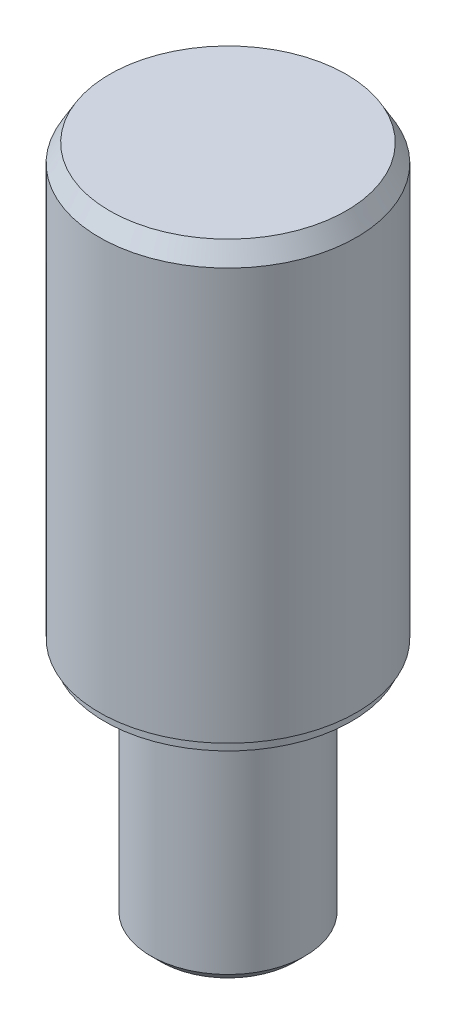
ISO-10303-21;
HEADER;
FILE_DESCRIPTION(('STEP AP214'),'2;1');
FILE_NAME('part.step','',(''),(''),'','','');
FILE_SCHEMA(('AUTOMOTIVE_DESIGN { 1 0 10303 214 1 1 1 1 }'));
ENDSEC;
DATA;
#1=APPLICATION_CONTEXT('core data for automotive mechanical design processes');
#2=APPLICATION_PROTOCOL_DEFINITION('international standard','automotive_design',2000,#1);
#3=PRODUCT_CONTEXT('',#1,'mechanical');
#4=PRODUCT('Part','Part','',(#3));
#5=PRODUCT_RELATED_PRODUCT_CATEGORY('part','',(#4));
#6=PRODUCT_DEFINITION_FORMATION('','',#4);
#7=PRODUCT_DEFINITION_CONTEXT('part definition',#1,'design');
#8=PRODUCT_DEFINITION('design','',#6,#7);
#9=PRODUCT_DEFINITION_SHAPE('','',#8);
#10=(LENGTH_UNIT() NAMED_UNIT(*) SI_UNIT(.MILLI.,.METRE.));
#11=(NAMED_UNIT(*) PLANE_ANGLE_UNIT() SI_UNIT($,.RADIAN.));
#12=(NAMED_UNIT(*) SI_UNIT($,.STERADIAN.) SOLID_ANGLE_UNIT());
#13=UNCERTAINTY_MEASURE_WITH_UNIT(LENGTH_MEASURE(1.E-05),#10,'distance_accuracy_value','');
#14=(GEOMETRIC_REPRESENTATION_CONTEXT(3) GLOBAL_UNCERTAINTY_ASSIGNED_CONTEXT((#13)) GLOBAL_UNIT_ASSIGNED_CONTEXT((#10,
#11,#12)) REPRESENTATION_CONTEXT('',''));
#15=CARTESIAN_POINT('',(0.,0.,0.));
#16=DIRECTION('',(0.,0.,1.));
#17=DIRECTION('',(1.,0.,0.));
#18=AXIS2_PLACEMENT_3D('',#15,#16,#17);
#19=CARTESIAN_POINT('',(6.5,-23.7320508075689,0.));
#20=DIRECTION('',(0.,-1.,0.));
#21=DIRECTION('',(0.,0.,-1.));
#22=AXIS2_PLACEMENT_3D('',#19,#20,#21);
#23=PLANE('',#22);
#24=CARTESIAN_POINT('',(0.,-23.7320508075689,0.));
#25=DIRECTION('',(0.,-1.,0.));
#26=DIRECTION('',(0.,0.,-1.));
#27=AXIS2_PLACEMENT_3D('',#24,#25,#26);
#28=CIRCLE('',#27,6.5);
#29=CARTESIAN_POINT('',(0.,-23.7320508075689,-6.5));
#30=VERTEX_POINT('',#29);
#31=EDGE_CURVE('E59',#30,#30,#28,.T.);
#32=ORIENTED_EDGE('',*,*,#31,.T.);
#33=EDGE_LOOP('',(#32));
#34=FACE_BOUND('',#33,.T.);
#35=ADVANCED_FACE('F31',(#34),#23,.T.);
#36=CARTESIAN_POINT('',(0.,42.,0.));
#37=DIRECTION('',(0.,1.,0.));
#38=DIRECTION('',(0.,0.,1.));
#39=AXIS2_PLACEMENT_3D('',#36,#37,#38);
#40=PLANE('',#39);
#41=CARTESIAN_POINT('',(0.,42.,0.));
#42=DIRECTION('',(0.,-1.,0.));
#43=DIRECTION('',(0.,0.,-1.));
#44=AXIS2_PLACEMENT_3D('',#41,#42,#43);
#45=CIRCLE('',#44,11.5);
#46=CARTESIAN_POINT('',(0.,42.,-11.5));
#47=VERTEX_POINT('',#46);
#48=EDGE_CURVE('E10',#47,#47,#45,.T.);
#49=ORIENTED_EDGE('',*,*,#48,.F.);
#50=EDGE_LOOP('',(#49));
#51=FACE_BOUND('',#50,.T.);
#52=ADVANCED_FACE('F76',(#51),#40,.T.);
#53=CARTESIAN_POINT('',(0.,40.2679491924311,0.));
#54=DIRECTION('',(0.,-1.,0.));
#55=DIRECTION('',(0.,0.,-1.));
#56=AXIS2_PLACEMENT_3D('',#53,#54,#55);
#57=CONICAL_SURFACE('',#56,12.5,0.523598775598297);
#58=ORIENTED_EDGE('',*,*,#48,.T.);
#59=EDGE_LOOP('',(#58));
#60=FACE_BOUND('',#59,.T.);
#61=CARTESIAN_POINT('',(0.,40.2679491924311,0.));
#62=DIRECTION('',(0.,-1.,0.));
#63=DIRECTION('',(0.,0.,-1.));
#64=AXIS2_PLACEMENT_3D('',#61,#62,#63);
#65=CIRCLE('',#64,12.5);
#66=CARTESIAN_POINT('',(0.,40.2679491924311,-12.5));
#67=VERTEX_POINT('',#66);
#68=EDGE_CURVE('E37',#67,#67,#65,.T.);
#69=ORIENTED_EDGE('',*,*,#68,.F.);
#70=EDGE_LOOP('',(#69));
#71=FACE_BOUND('',#70,.T.);
#72=ADVANCED_FACE('F80',(#60,#71),#57,.T.);
#73=CARTESIAN_POINT('',(0.,0.,0.));
#74=DIRECTION('',(0.,-1.,0.));
#75=DIRECTION('',(0.,0.,-1.));
#76=AXIS2_PLACEMENT_3D('',#73,#74,#75);
#77=CYLINDRICAL_SURFACE('',#76,12.5);
#78=ORIENTED_EDGE('',*,*,#68,.T.);
#79=EDGE_LOOP('',(#78));
#80=FACE_BOUND('',#79,.T.);
#81=CARTESIAN_POINT('',(0.,0.267949192431116,0.));
#82=DIRECTION('',(0.,-1.,0.));
#83=DIRECTION('',(0.,0.,-1.));
#84=AXIS2_PLACEMENT_3D('',#81,#82,#83);
#85=CIRCLE('',#84,12.5);
#86=CARTESIAN_POINT('',(0.,0.267949192431116,-12.5));
#87=VERTEX_POINT('',#86);
#88=EDGE_CURVE('E41',#87,#87,#85,.T.);
#89=ORIENTED_EDGE('',*,*,#88,.F.);
#90=EDGE_LOOP('',(#89));
#91=FACE_BOUND('',#90,.T.);
#92=ADVANCED_FACE('F85',(#80,#91),#77,.T.);
#93=CARTESIAN_POINT('',(12.5,0.267949192431117,0.));
#94=DIRECTION('',(0.,-1.,0.));
#95=DIRECTION('',(0.,0.,-1.));
#96=AXIS2_PLACEMENT_3D('',#93,#94,#95);
#97=PLANE('',#96);
#98=ORIENTED_EDGE('',*,*,#88,.T.);
#99=EDGE_LOOP('',(#98));
#100=FACE_BOUND('',#99,.T.);
#101=CARTESIAN_POINT('',(0.,0.267949192431117,0.));
#102=DIRECTION('',(0.,-1.,0.));
#103=DIRECTION('',(0.,0.,-1.));
#104=AXIS2_PLACEMENT_3D('',#101,#102,#103);
#105=CIRCLE('',#104,12.);
#106=CARTESIAN_POINT('',(0.,0.267949192431117,-12.));
#107=VERTEX_POINT('',#106);
#108=EDGE_CURVE('E45',#107,#107,#105,.T.);
#109=ORIENTED_EDGE('',*,*,#108,.F.);
#110=EDGE_LOOP('',(#109));
#111=FACE_BOUND('',#110,.T.);
#112=ADVANCED_FACE('F90',(#100,#111),#97,.T.);
#113=CARTESIAN_POINT('',(0.,0.,0.));
#114=DIRECTION('',(0.,-1.,0.));
#115=DIRECTION('',(0.,0.,-1.));
#116=AXIS2_PLACEMENT_3D('',#113,#114,#115);
#117=CYLINDRICAL_SURFACE('',#116,12.);
#118=ORIENTED_EDGE('',*,*,#108,.T.);
#119=EDGE_LOOP('',(#118));
#120=FACE_BOUND('',#119,.T.);
#121=CARTESIAN_POINT('',(0.,-0.732050807568883,0.));
#122=DIRECTION('',(0.,-1.,0.));
#123=DIRECTION('',(0.,0.,-1.));
#124=AXIS2_PLACEMENT_3D('',#121,#122,#123);
#125=CIRCLE('',#124,12.);
#126=CARTESIAN_POINT('',(0.,-0.732050807568883,-12.));
#127=VERTEX_POINT('',#126);
#128=EDGE_CURVE('E50',#127,#127,#125,.T.);
#129=ORIENTED_EDGE('',*,*,#128,.F.);
#130=EDGE_LOOP('',(#129));
#131=FACE_BOUND('',#130,.T.);
#132=ADVANCED_FACE('F93',(#120,#131),#117,.T.);
#133=CARTESIAN_POINT('',(12.,-0.732050807568884,0.));
#134=DIRECTION('',(0.,-1.,0.));
#135=DIRECTION('',(0.,0.,-1.));
#136=AXIS2_PLACEMENT_3D('',#133,#134,#135);
#137=PLANE('',#136);
#138=ORIENTED_EDGE('',*,*,#128,.T.);
#139=EDGE_LOOP('',(#138));
#140=FACE_BOUND('',#139,.T.);
#141=CARTESIAN_POINT('',(0.,-0.732050807568885,0.));
#142=DIRECTION('',(0.,-1.,0.));
#143=DIRECTION('',(0.,0.,-1.));
#144=AXIS2_PLACEMENT_3D('',#141,#142,#143);
#145=CIRCLE('',#144,7.5);
#146=CARTESIAN_POINT('',(0.,-0.732050807568885,-7.5));
#147=VERTEX_POINT('',#146);
#148=EDGE_CURVE('E53',#147,#147,#145,.T.);
#149=ORIENTED_EDGE('',*,*,#148,.F.);
#150=EDGE_LOOP('',(#149));
#151=FACE_BOUND('',#150,.T.);
#152=ADVANCED_FACE('F72',(#140,#151),#137,.T.);
#153=CARTESIAN_POINT('',(0.,0.,0.));
#154=DIRECTION('',(0.,-1.,0.));
#155=DIRECTION('',(0.,0.,-1.));
#156=AXIS2_PLACEMENT_3D('',#153,#154,#155);
#157=CYLINDRICAL_SURFACE('',#156,7.5);
#158=ORIENTED_EDGE('',*,*,#148,.T.);
#159=EDGE_LOOP('',(#158));
#160=FACE_BOUND('',#159,.T.);
#161=CARTESIAN_POINT('',(0.,-22.7320508075689,0.));
#162=DIRECTION('',(0.,-1.,0.));
#163=DIRECTION('',(0.,0.,-1.));
#164=AXIS2_PLACEMENT_3D('',#161,#162,#163);
#165=CIRCLE('',#164,7.5);
#166=CARTESIAN_POINT('',(0.,-22.7320508075689,-7.5));
#167=VERTEX_POINT('',#166);
#168=EDGE_CURVE('E56',#167,#167,#165,.T.);
#169=ORIENTED_EDGE('',*,*,#168,.F.);
#170=EDGE_LOOP('',(#169));
#171=FACE_BOUND('',#170,.T.);
#172=ADVANCED_FACE('F66',(#160,#171),#157,.T.);
#173=CARTESIAN_POINT('',(0.,-23.7320508075689,0.));
#174=DIRECTION('',(0.,1.,0.));
#175=DIRECTION('',(0.,0.,1.));
#176=AXIS2_PLACEMENT_3D('',#173,#174,#175);
#177=CONICAL_SURFACE('',#176,6.5,0.785398163397448);
#178=ORIENTED_EDGE('',*,*,#168,.T.);
#179=EDGE_LOOP('',(#178));
#180=FACE_BOUND('',#179,.T.);
#181=ORIENTED_EDGE('',*,*,#31,.F.);
#182=EDGE_LOOP('',(#181));
#183=FACE_BOUND('',#182,.T.);
#184=ADVANCED_FACE('F64',(#180,#183),#177,.T.);
#185=CLOSED_SHELL('',(#35,#52,#72,#92,#112,#132,#152,#172,#184));
#186=MANIFOLD_SOLID_BREP('B2',#185);
#187=ADVANCED_BREP_SHAPE_REPRESENTATION('',(#18,#186),#14);
#188=SHAPE_DEFINITION_REPRESENTATION(#9,#187);
ENDSEC;
END-ISO-10303-21;
